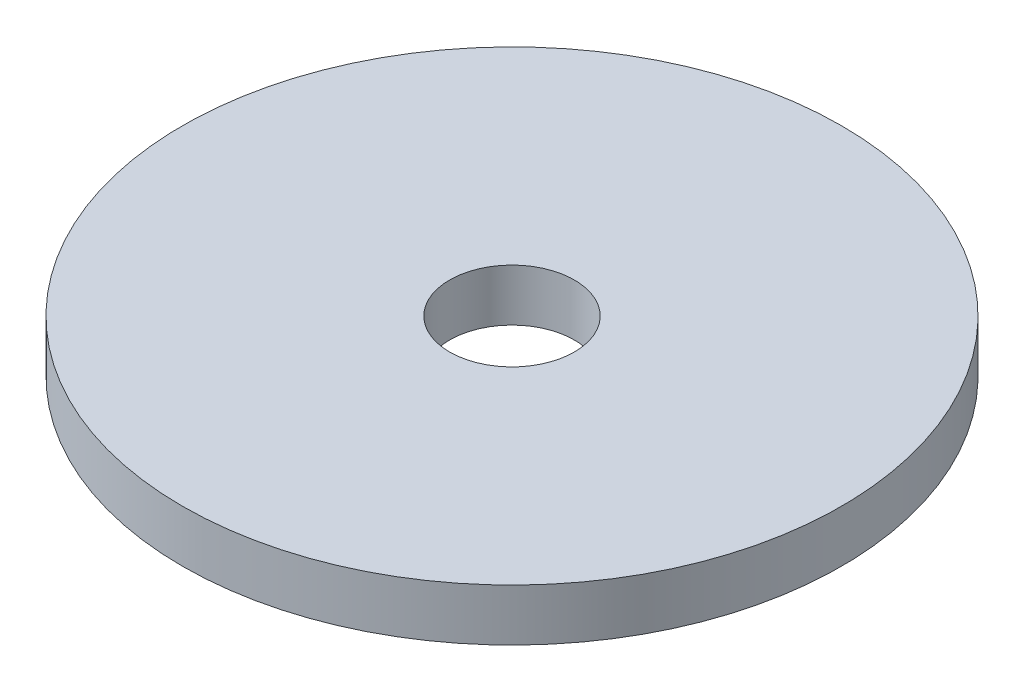
ISO-10303-21;
HEADER;
FILE_DESCRIPTION(('STEP AP214'),'2;1');
FILE_NAME('part.step','',(''),(''),'','','');
FILE_SCHEMA(('AUTOMOTIVE_DESIGN { 1 0 10303 214 1 1 1 1 }'));
ENDSEC;
DATA;
#1=APPLICATION_CONTEXT('core data for automotive mechanical design processes');
#2=APPLICATION_PROTOCOL_DEFINITION('international standard','automotive_design',2000,#1);
#3=PRODUCT_CONTEXT('',#1,'mechanical');
#4=PRODUCT('Part','Part','',(#3));
#5=PRODUCT_RELATED_PRODUCT_CATEGORY('part','',(#4));
#6=PRODUCT_DEFINITION_FORMATION('','',#4);
#7=PRODUCT_DEFINITION_CONTEXT('part definition',#1,'design');
#8=PRODUCT_DEFINITION('design','',#6,#7);
#9=PRODUCT_DEFINITION_SHAPE('','',#8);
#10=(LENGTH_UNIT() NAMED_UNIT(*) SI_UNIT(.MILLI.,.METRE.));
#11=(NAMED_UNIT(*) PLANE_ANGLE_UNIT() SI_UNIT($,.RADIAN.));
#12=(NAMED_UNIT(*) SI_UNIT($,.STERADIAN.) SOLID_ANGLE_UNIT());
#13=UNCERTAINTY_MEASURE_WITH_UNIT(LENGTH_MEASURE(1.E-05),#10,'distance_accuracy_value','');
#14=(GEOMETRIC_REPRESENTATION_CONTEXT(3) GLOBAL_UNCERTAINTY_ASSIGNED_CONTEXT((#13)) GLOBAL_UNIT_ASSIGNED_CONTEXT((#10,
#11,#12)) REPRESENTATION_CONTEXT('',''));
#15=CARTESIAN_POINT('',(0.,0.,0.));
#16=DIRECTION('',(0.,0.,1.));
#17=DIRECTION('',(1.,0.,0.));
#18=AXIS2_PLACEMENT_3D('',#15,#16,#17);
#19=CARTESIAN_POINT('',(0.,2.5,0.));
#20=DIRECTION('',(0.,1.,0.));
#21=DIRECTION('',(0.,0.,1.));
#22=AXIS2_PLACEMENT_3D('',#19,#20,#21);
#23=PLANE('',#22);
#24=CARTESIAN_POINT('',(0.,2.5,0.));
#25=DIRECTION('',(0.,1.,0.));
#26=DIRECTION('',(0.,0.,1.));
#27=AXIS2_PLACEMENT_3D('',#24,#25,#26);
#28=CIRCLE('',#27,15.845);
#29=CARTESIAN_POINT('',(0.,2.5,15.845));
#30=VERTEX_POINT('',#29);
#31=EDGE_CURVE('E10',#30,#30,#28,.T.);
#32=ORIENTED_EDGE('',*,*,#31,.T.);
#33=EDGE_LOOP('',(#32));
#34=FACE_BOUND('',#33,.T.);
#35=CARTESIAN_POINT('',(0.,2.5,0.));
#36=DIRECTION('',(0.,1.,0.));
#37=DIRECTION('',(0.,0.,1.));
#38=AXIS2_PLACEMENT_3D('',#35,#36,#37);
#39=CIRCLE('',#38,3.);
#40=CARTESIAN_POINT('',(0.,2.5,3.));
#41=VERTEX_POINT('',#40);
#42=EDGE_CURVE('E42',#41,#41,#39,.T.);
#43=ORIENTED_EDGE('',*,*,#42,.F.);
#44=EDGE_LOOP('',(#43));
#45=FACE_BOUND('',#44,.T.);
#46=ADVANCED_FACE('F31',(#34,#45),#23,.T.);
#47=CARTESIAN_POINT('',(0.,0.,0.));
#48=DIRECTION('',(0.,1.,0.));
#49=DIRECTION('',(0.,0.,1.));
#50=AXIS2_PLACEMENT_3D('',#47,#48,#49);
#51=PLANE('',#50);
#52=CARTESIAN_POINT('',(0.,0.,0.));
#53=DIRECTION('',(0.,1.,0.));
#54=DIRECTION('',(0.,0.,1.));
#55=AXIS2_PLACEMENT_3D('',#52,#53,#54);
#56=CIRCLE('',#55,15.845);
#57=CARTESIAN_POINT('',(0.,0.,15.845));
#58=VERTEX_POINT('',#57);
#59=EDGE_CURVE('E35',#58,#58,#56,.T.);
#60=ORIENTED_EDGE('',*,*,#59,.F.);
#61=EDGE_LOOP('',(#60));
#62=FACE_BOUND('',#61,.T.);
#63=CARTESIAN_POINT('',(0.,0.,0.));
#64=DIRECTION('',(0.,1.,0.));
#65=DIRECTION('',(0.,0.,1.));
#66=AXIS2_PLACEMENT_3D('',#63,#64,#65);
#67=CIRCLE('',#66,3.);
#68=CARTESIAN_POINT('',(0.,0.,3.));
#69=VERTEX_POINT('',#68);
#70=EDGE_CURVE('E44',#69,#69,#67,.T.);
#71=ORIENTED_EDGE('',*,*,#70,.T.);
#72=EDGE_LOOP('',(#71));
#73=FACE_BOUND('',#72,.T.);
#74=ADVANCED_FACE('F54',(#62,#73),#51,.F.);
#75=CARTESIAN_POINT('',(0.,2.5,0.));
#76=DIRECTION('',(0.,-1.,0.));
#77=DIRECTION('',(0.,0.,-1.));
#78=AXIS2_PLACEMENT_3D('',#75,#76,#77);
#79=CYLINDRICAL_SURFACE('',#78,15.845);
#80=ORIENTED_EDGE('',*,*,#31,.F.);
#81=EDGE_LOOP('',(#80));
#82=FACE_BOUND('',#81,.T.);
#83=ORIENTED_EDGE('',*,*,#59,.T.);
#84=EDGE_LOOP('',(#83));
#85=FACE_BOUND('',#84,.T.);
#86=ADVANCED_FACE('F33',(#82,#85),#79,.T.);
#87=CARTESIAN_POINT('',(0.,2.5,0.));
#88=DIRECTION('',(0.,-1.,0.));
#89=DIRECTION('',(0.,0.,-1.));
#90=AXIS2_PLACEMENT_3D('',#87,#88,#89);
#91=CYLINDRICAL_SURFACE('',#90,3.);
#92=ORIENTED_EDGE('',*,*,#42,.T.);
#93=EDGE_LOOP('',(#92));
#94=FACE_BOUND('',#93,.T.);
#95=ORIENTED_EDGE('',*,*,#70,.F.);
#96=EDGE_LOOP('',(#95));
#97=FACE_BOUND('',#96,.T.);
#98=ADVANCED_FACE('F50',(#94,#97),#91,.F.);
#99=CLOSED_SHELL('',(#46,#74,#86,#98));
#100=MANIFOLD_SOLID_BREP('B2',#99);
#101=ADVANCED_BREP_SHAPE_REPRESENTATION('',(#18,#100),#14);
#102=SHAPE_DEFINITION_REPRESENTATION(#9,#101);
ENDSEC;
END-ISO-10303-21;
